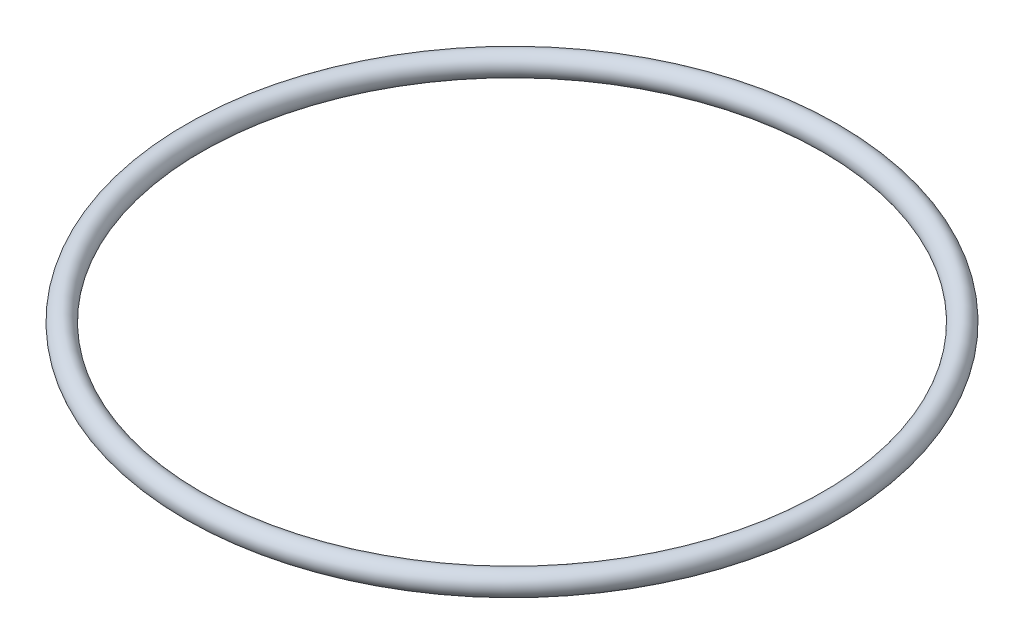
ISO-10303-21;
HEADER;
FILE_DESCRIPTION(('STEP AP214'),'2;1');
FILE_NAME('part.step','',(''),(''),'','','');
FILE_SCHEMA(('AUTOMOTIVE_DESIGN { 1 0 10303 214 1 1 1 1 }'));
ENDSEC;
DATA;
#1=APPLICATION_CONTEXT('core data for automotive mechanical design processes');
#2=APPLICATION_PROTOCOL_DEFINITION('international standard','automotive_design',2000,#1);
#3=PRODUCT_CONTEXT('',#1,'mechanical');
#4=PRODUCT('Part','Part','',(#3));
#5=PRODUCT_RELATED_PRODUCT_CATEGORY('part','',(#4));
#6=PRODUCT_DEFINITION_FORMATION('','',#4);
#7=PRODUCT_DEFINITION_CONTEXT('part definition',#1,'design');
#8=PRODUCT_DEFINITION('design','',#6,#7);
#9=PRODUCT_DEFINITION_SHAPE('','',#8);
#10=(LENGTH_UNIT() NAMED_UNIT(*) SI_UNIT(.MILLI.,.METRE.));
#11=(NAMED_UNIT(*) PLANE_ANGLE_UNIT() SI_UNIT($,.RADIAN.));
#12=(NAMED_UNIT(*) SI_UNIT($,.STERADIAN.) SOLID_ANGLE_UNIT());
#13=UNCERTAINTY_MEASURE_WITH_UNIT(LENGTH_MEASURE(1.E-05),#10,'distance_accuracy_value','');
#14=(GEOMETRIC_REPRESENTATION_CONTEXT(3) GLOBAL_UNCERTAINTY_ASSIGNED_CONTEXT((#13)) GLOBAL_UNIT_ASSIGNED_CONTEXT((#10,
#11,#12)) REPRESENTATION_CONTEXT('',''));
#15=CARTESIAN_POINT('',(0.,0.,0.));
#16=DIRECTION('',(0.,0.,1.));
#17=DIRECTION('',(1.,0.,0.));
#18=AXIS2_PLACEMENT_3D('',#15,#16,#17);
#19=CARTESIAN_POINT('',(0.,0.,0.));
#20=DIRECTION('',(0.,-1.,0.));
#21=DIRECTION('',(0.,0.,-1.));
#22=AXIS2_PLACEMENT_3D('',#19,#20,#21);
#23=TOROIDAL_SURFACE('',#22,25.7,0.9);
#24=CARTESIAN_POINT('',(0.,0.,-26.6));
#25=VERTEX_POINT('',#24);
#26=VERTEX_LOOP('',#25);
#27=FACE_BOUND('',#26,.T.);
#28=ADVANCED_FACE('F28',(#27),#23,.T.);
#29=CLOSED_SHELL('',(#28));
#30=MANIFOLD_SOLID_BREP('B2',#29);
#31=ADVANCED_BREP_SHAPE_REPRESENTATION('',(#18,#30),#14);
#32=SHAPE_DEFINITION_REPRESENTATION(#9,#31);
ENDSEC;
END-ISO-10303-21;
